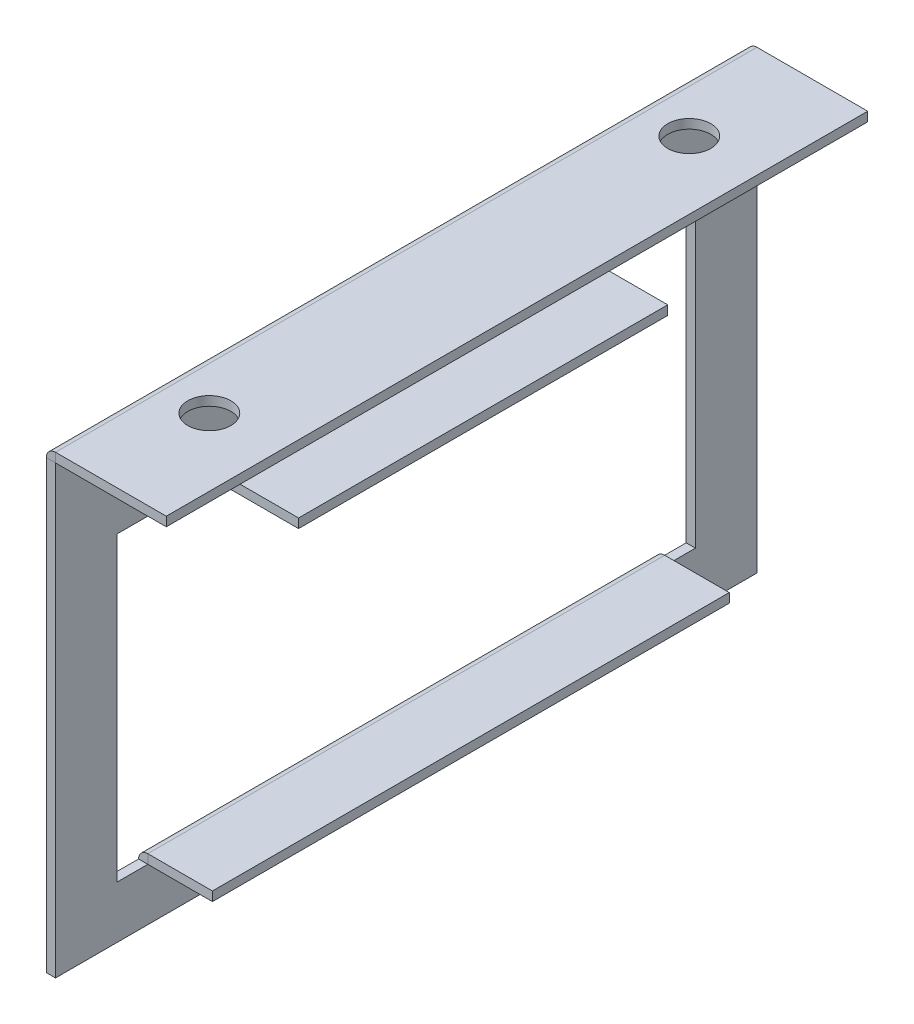
ISO-10303-21;
HEADER;
FILE_DESCRIPTION(('STEP AP214'),'2;1');
FILE_NAME('part.step','',(''),(''),'','','');
FILE_SCHEMA(('AUTOMOTIVE_DESIGN { 1 0 10303 214 1 1 1 1 }'));
ENDSEC;
DATA;
#1=APPLICATION_CONTEXT('core data for automotive mechanical design processes');
#2=APPLICATION_PROTOCOL_DEFINITION('international standard','automotive_design',2000,#1);
#3=PRODUCT_CONTEXT('',#1,'mechanical');
#4=PRODUCT('Part','Part','',(#3));
#5=PRODUCT_RELATED_PRODUCT_CATEGORY('part','',(#4));
#6=PRODUCT_DEFINITION_FORMATION('','',#4);
#7=PRODUCT_DEFINITION_CONTEXT('part definition',#1,'design');
#8=PRODUCT_DEFINITION('design','',#6,#7);
#9=PRODUCT_DEFINITION_SHAPE('','',#8);
#10=(LENGTH_UNIT() NAMED_UNIT(*) SI_UNIT(.MILLI.,.METRE.));
#11=(NAMED_UNIT(*) PLANE_ANGLE_UNIT() SI_UNIT($,.RADIAN.));
#12=(NAMED_UNIT(*) SI_UNIT($,.STERADIAN.) SOLID_ANGLE_UNIT());
#13=UNCERTAINTY_MEASURE_WITH_UNIT(LENGTH_MEASURE(1.E-05),#10,'distance_accuracy_value','');
#14=(GEOMETRIC_REPRESENTATION_CONTEXT(3) GLOBAL_UNCERTAINTY_ASSIGNED_CONTEXT((#13)) GLOBAL_UNIT_ASSIGNED_CONTEXT((#10,
#11,#12)) REPRESENTATION_CONTEXT('',''));
#15=CARTESIAN_POINT('',(0.,0.,0.));
#16=DIRECTION('',(0.,0.,1.));
#17=DIRECTION('',(1.,0.,0.));
#18=AXIS2_PLACEMENT_3D('',#15,#16,#17);
#19=CARTESIAN_POINT('',(0.,-65.5,47.));
#20=DIRECTION('',(0.,-1.,0.));
#21=DIRECTION('',(0.,0.,-1.));
#22=AXIS2_PLACEMENT_3D('',#19,#20,#21);
#23=PLANE('',#22);
#24=DIRECTION('',(1.,0.,0.));
#25=VECTOR('',#24,1.);
#26=CARTESIAN_POINT('',(0.,-65.5,42.));
#27=LINE('',#26,#25);
#28=CARTESIAN_POINT('',(0.,-65.5,42.));
#29=VERTEX_POINT('',#28);
#30=CARTESIAN_POINT('',(1.49999999999998,-65.5,42.));
#31=VERTEX_POINT('',#30);
#32=EDGE_CURVE('E223',#29,#31,#27,.T.);
#33=ORIENTED_EDGE('',*,*,#32,.F.);
#34=DIRECTION('',(0.,0.,-1.));
#35=VECTOR('',#34,1.);
#36=CARTESIAN_POINT('',(0.,-65.5,47.));
#37=LINE('',#36,#35);
#38=CARTESIAN_POINT('',(0.,-65.5,47.));
#39=VERTEX_POINT('',#38);
#40=EDGE_CURVE('E314',#39,#29,#37,.T.);
#41=ORIENTED_EDGE('',*,*,#40,.F.);
#42=DIRECTION('',(1.,0.,0.));
#43=VECTOR('',#42,1.);
#44=CARTESIAN_POINT('',(0.,-65.5,47.));
#45=LINE('',#44,#43);
#46=CARTESIAN_POINT('',(1.5,-65.5,47.));
#47=VERTEX_POINT('',#46);
#48=EDGE_CURVE('E355',#39,#47,#45,.T.);
#49=ORIENTED_EDGE('',*,*,#48,.T.);
#50=DIRECTION('',(0.,0.,-1.));
#51=VECTOR('',#50,1.);
#52=CARTESIAN_POINT('',(1.5,-65.5,47.));
#53=LINE('',#52,#51);
#54=EDGE_CURVE('E255',#47,#31,#53,.T.);
#55=ORIENTED_EDGE('',*,*,#54,.T.);
#56=EDGE_LOOP('',(#33,#41,#49,#55));
#57=FACE_BOUND('',#56,.T.);
#58=ADVANCED_FACE('F39',(#57),#23,.F.);
#59=CARTESIAN_POINT('',(0.,-16.5,47.));
#60=DIRECTION('',(0.,1.,0.));
#61=DIRECTION('',(0.,0.,1.));
#62=AXIS2_PLACEMENT_3D('',#59,#60,#61);
#63=PLANE('',#62);
#64=DIRECTION('',(1.,0.,0.));
#65=VECTOR('',#64,1.);
#66=CARTESIAN_POINT('',(0.,-16.5,-30.));
#67=LINE('',#66,#65);
#68=CARTESIAN_POINT('',(0.,-16.5,-30.));
#69=VERTEX_POINT('',#68);
#70=CARTESIAN_POINT('',(1.5,-16.5,-30.));
#71=VERTEX_POINT('',#70);
#72=EDGE_CURVE('E541',#69,#71,#67,.T.);
#73=ORIENTED_EDGE('',*,*,#72,.F.);
#74=DIRECTION('',(0.,0.,1.));
#75=VECTOR('',#74,1.);
#76=CARTESIAN_POINT('',(0.,-16.5,47.));
#77=LINE('',#76,#75);
#78=CARTESIAN_POINT('',(0.,-16.5,-47.));
#79=VERTEX_POINT('',#78);
#80=EDGE_CURVE('E352',#79,#69,#77,.T.);
#81=ORIENTED_EDGE('',*,*,#80,.F.);
#82=DIRECTION('',(1.,0.,0.));
#83=VECTOR('',#82,1.);
#84=CARTESIAN_POINT('',(0.,-16.5,-47.));
#85=LINE('',#84,#83);
#86=CARTESIAN_POINT('',(1.5,-16.5,-47.));
#87=VERTEX_POINT('',#86);
#88=EDGE_CURVE('E369',#79,#87,#85,.T.);
#89=ORIENTED_EDGE('',*,*,#88,.T.);
#90=DIRECTION('',(0.,0.,1.));
#91=VECTOR('',#90,1.);
#92=CARTESIAN_POINT('',(1.5,-16.5,47.));
#93=LINE('',#92,#91);
#94=EDGE_CURVE('E359',#87,#71,#93,.T.);
#95=ORIENTED_EDGE('',*,*,#94,.T.);
#96=EDGE_LOOP('',(#73,#81,#89,#95));
#97=FACE_BOUND('',#96,.T.);
#98=ADVANCED_FACE('F281',(#97),#63,.F.);
#99=CARTESIAN_POINT('',(1.5,-1.5,57.));
#100=DIRECTION('',(0.,0.,1.));
#101=DIRECTION('',(1.,0.,0.));
#102=AXIS2_PLACEMENT_3D('',#99,#100,#101);
#103=PLANE('',#102);
#104=DIRECTION('',(0.,1.,0.));
#105=VECTOR('',#104,1.);
#106=CARTESIAN_POINT('',(1.5,-1.5,57.));
#107=LINE('',#106,#105);
#108=CARTESIAN_POINT('',(1.5,-1.5,57.));
#109=VERTEX_POINT('',#108);
#110=CARTESIAN_POINT('',(1.5,0.,57.));
#111=VERTEX_POINT('',#110);
#112=EDGE_CURVE('E11',#109,#111,#107,.T.);
#113=ORIENTED_EDGE('',*,*,#112,.F.);
#114=DIRECTION('',(1.,0.,0.));
#115=VECTOR('',#114,1.);
#116=CARTESIAN_POINT('',(0.,-1.5,57.));
#117=LINE('',#116,#115);
#118=CARTESIAN_POINT('',(19.5,-1.5,57.));
#119=VERTEX_POINT('',#118);
#120=EDGE_CURVE('E386',#109,#119,#117,.T.);
#121=ORIENTED_EDGE('',*,*,#120,.T.);
#122=DIRECTION('',(0.,-1.,0.));
#123=VECTOR('',#122,1.);
#124=CARTESIAN_POINT('',(19.5,0.,57.));
#125=LINE('',#124,#123);
#126=CARTESIAN_POINT('',(19.5,0.,57.));
#127=VERTEX_POINT('',#126);
#128=EDGE_CURVE('E388',#127,#119,#125,.T.);
#129=ORIENTED_EDGE('',*,*,#128,.F.);
#130=DIRECTION('',(1.,0.,0.));
#131=VECTOR('',#130,1.);
#132=CARTESIAN_POINT('',(0.,0.,57.));
#133=LINE('',#132,#131);
#134=EDGE_CURVE('E392',#111,#127,#133,.T.);
#135=ORIENTED_EDGE('',*,*,#134,.F.);
#136=EDGE_LOOP('',(#113,#121,#129,#135));
#137=FACE_BOUND('',#136,.T.);
#138=ADVANCED_FACE('F41',(#137),#103,.T.);
#139=CARTESIAN_POINT('',(1.5,-1.5,57.));
#140=DIRECTION('',(0.,0.,1.));
#141=DIRECTION('',(1.,0.,0.));
#142=AXIS2_PLACEMENT_3D('',#139,#140,#141);
#143=PLANE('',#142);
#144=DIRECTION('',(-1.,0.,0.));
#145=VECTOR('',#144,1.);
#146=CARTESIAN_POINT('',(1.5,-1.5,57.));
#147=LINE('',#146,#145);
#148=CARTESIAN_POINT('',(0.,-1.5,57.));
#149=VERTEX_POINT('',#148);
#150=EDGE_CURVE('E48',#109,#149,#147,.T.);
#151=ORIENTED_EDGE('',*,*,#150,.F.);
#152=ORIENTED_EDGE('',*,*,#112,.T.);
#153=CARTESIAN_POINT('',(1.5,-1.5,57.));
#154=DIRECTION('',(0.,0.,1.));
#155=DIRECTION('',(1.,0.,0.));
#156=AXIS2_PLACEMENT_3D('',#153,#154,#155);
#157=CIRCLE('',#156,1.5);
#158=EDGE_CURVE('E395',#149,#111,#157,.F.);
#159=ORIENTED_EDGE('',*,*,#158,.F.);
#160=EDGE_LOOP('',(#151,#152,#159));
#161=FACE_BOUND('',#160,.T.);
#162=ADVANCED_FACE('F461',(#161),#143,.T.);
#163=CARTESIAN_POINT('',(1.5,-1.5,-57.));
#164=DIRECTION('',(0.,0.,-1.));
#165=DIRECTION('',(-1.,0.,0.));
#166=AXIS2_PLACEMENT_3D('',#163,#164,#165);
#167=PLANE('',#166);
#168=DIRECTION('',(-1.,0.,0.));
#169=VECTOR('',#168,1.);
#170=CARTESIAN_POINT('',(1.5,-1.5,-57.));
#171=LINE('',#170,#169);
#172=CARTESIAN_POINT('',(1.5,-1.5,-57.));
#173=VERTEX_POINT('',#172);
#174=CARTESIAN_POINT('',(0.,-1.5,-57.));
#175=VERTEX_POINT('',#174);
#176=EDGE_CURVE('E445',#173,#175,#171,.T.);
#177=ORIENTED_EDGE('',*,*,#176,.F.);
#178=DIRECTION('',(0.,1.,0.));
#179=VECTOR('',#178,1.);
#180=CARTESIAN_POINT('',(1.5,-74.,-57.));
#181=LINE('',#180,#179);
#182=CARTESIAN_POINT('',(1.5,-74.,-57.));
#183=VERTEX_POINT('',#182);
#184=EDGE_CURVE('E389',#183,#173,#181,.T.);
#185=ORIENTED_EDGE('',*,*,#184,.F.);
#186=DIRECTION('',(-1.,0.,0.));
#187=VECTOR('',#186,1.);
#188=CARTESIAN_POINT('',(1.5,-74.,-57.));
#189=LINE('',#188,#187);
#190=CARTESIAN_POINT('',(0.,-74.,-57.));
#191=VERTEX_POINT('',#190);
#192=EDGE_CURVE('E422',#183,#191,#189,.T.);
#193=ORIENTED_EDGE('',*,*,#192,.T.);
#194=DIRECTION('',(0.,1.,0.));
#195=VECTOR('',#194,1.);
#196=CARTESIAN_POINT('',(0.,-74.,-57.));
#197=LINE('',#196,#195);
#198=EDGE_CURVE('E419',#191,#175,#197,.T.);
#199=ORIENTED_EDGE('',*,*,#198,.T.);
#200=EDGE_LOOP('',(#177,#185,#193,#199));
#201=FACE_BOUND('',#200,.T.);
#202=ADVANCED_FACE('F484',(#201),#167,.T.);
#203=CARTESIAN_POINT('',(1.5,-1.5,-57.));
#204=DIRECTION('',(0.,0.,-1.));
#205=DIRECTION('',(-1.,0.,0.));
#206=AXIS2_PLACEMENT_3D('',#203,#204,#205);
#207=PLANE('',#206);
#208=DIRECTION('',(0.,1.,0.));
#209=VECTOR('',#208,1.);
#210=CARTESIAN_POINT('',(1.5,-1.5,-57.));
#211=LINE('',#210,#209);
#212=CARTESIAN_POINT('',(1.5,0.,-57.));
#213=VERTEX_POINT('',#212);
#214=EDGE_CURVE('E443',#173,#213,#211,.T.);
#215=ORIENTED_EDGE('',*,*,#214,.F.);
#216=ORIENTED_EDGE('',*,*,#176,.T.);
#217=CARTESIAN_POINT('',(1.5,-1.5,-57.));
#218=DIRECTION('',(0.,0.,1.));
#219=DIRECTION('',(1.,0.,0.));
#220=AXIS2_PLACEMENT_3D('',#217,#218,#219);
#221=CIRCLE('',#220,1.5);
#222=EDGE_CURVE('E416',#175,#213,#221,.F.);
#223=ORIENTED_EDGE('',*,*,#222,.T.);
#224=EDGE_LOOP('',(#215,#216,#223));
#225=FACE_BOUND('',#224,.T.);
#226=ADVANCED_FACE('F482',(#225),#207,.T.);
#227=CARTESIAN_POINT('',(0.,-1.5,57.));
#228=DIRECTION('',(0.,1.,0.));
#229=DIRECTION('',(0.,0.,1.));
#230=AXIS2_PLACEMENT_3D('',#227,#228,#229);
#231=PLANE('',#230);
#232=CARTESIAN_POINT('',(8.5,-1.5,-39.));
#233=DIRECTION('',(0.,1.,0.));
#234=DIRECTION('',(0.,0.,1.));
#235=AXIS2_PLACEMENT_3D('',#232,#233,#234);
#236=CIRCLE('',#235,3.5);
#237=CARTESIAN_POINT('',(8.5,-1.5,-35.5));
#238=VERTEX_POINT('',#237);
#239=EDGE_CURVE('E376',#238,#238,#236,.T.);
#240=ORIENTED_EDGE('',*,*,#239,.T.);
#241=EDGE_LOOP('',(#240));
#242=FACE_BOUND('',#241,.T.);
#243=CARTESIAN_POINT('',(8.5,-1.5,39.));
#244=DIRECTION('',(0.,1.,0.));
#245=DIRECTION('',(0.,0.,1.));
#246=AXIS2_PLACEMENT_3D('',#243,#244,#245);
#247=CIRCLE('',#246,3.5);
#248=CARTESIAN_POINT('',(8.5,-1.5,42.5));
#249=VERTEX_POINT('',#248);
#250=EDGE_CURVE('E382',#249,#249,#247,.T.);
#251=ORIENTED_EDGE('',*,*,#250,.T.);
#252=EDGE_LOOP('',(#251));
#253=FACE_BOUND('',#252,.T.);
#254=DIRECTION('',(1.,0.,0.));
#255=VECTOR('',#254,1.);
#256=CARTESIAN_POINT('',(0.,-1.5,-57.));
#257=LINE('',#256,#255);
#258=CARTESIAN_POINT('',(19.5,-1.5,-57.));
#259=VERTEX_POINT('',#258);
#260=EDGE_CURVE('E385',#173,#259,#257,.T.);
#261=ORIENTED_EDGE('',*,*,#260,.T.);
#262=DIRECTION('',(0.,0.,-1.));
#263=VECTOR('',#262,1.);
#264=CARTESIAN_POINT('',(19.5,-1.5,57.));
#265=LINE('',#264,#263);
#266=EDGE_CURVE('E441',#119,#259,#265,.T.);
#267=ORIENTED_EDGE('',*,*,#266,.F.);
#268=ORIENTED_EDGE('',*,*,#120,.F.);
#269=DIRECTION('',(0.,0.,-1.));
#270=VECTOR('',#269,1.);
#271=CARTESIAN_POINT('',(1.5,-1.5,57.));
#272=LINE('',#271,#270);
#273=EDGE_CURVE('E407',#109,#173,#272,.T.);
#274=ORIENTED_EDGE('',*,*,#273,.T.);
#275=EDGE_LOOP('',(#261,#267,#268,#274));
#276=FACE_BOUND('',#275,.T.);
#277=ADVANCED_FACE('F471',(#242,#253,#276),#231,.F.);
#278=CARTESIAN_POINT('',(19.5,0.,57.));
#279=DIRECTION('',(1.,0.,0.));
#280=DIRECTION('',(0.,0.,-1.));
#281=AXIS2_PLACEMENT_3D('',#278,#279,#280);
#282=PLANE('',#281);
#283=DIRECTION('',(0.,-1.,0.));
#284=VECTOR('',#283,1.);
#285=CARTESIAN_POINT('',(19.5,0.,-57.));
#286=LINE('',#285,#284);
#287=CARTESIAN_POINT('',(19.5,0.,-57.));
#288=VERTEX_POINT('',#287);
#289=EDGE_CURVE('E410',#288,#259,#286,.T.);
#290=ORIENTED_EDGE('',*,*,#289,.F.);
#291=DIRECTION('',(0.,0.,-1.));
#292=VECTOR('',#291,1.);
#293=CARTESIAN_POINT('',(19.5,0.,57.));
#294=LINE('',#293,#292);
#295=EDGE_CURVE('E439',#127,#288,#294,.T.);
#296=ORIENTED_EDGE('',*,*,#295,.F.);
#297=ORIENTED_EDGE('',*,*,#128,.T.);
#298=ORIENTED_EDGE('',*,*,#266,.T.);
#299=EDGE_LOOP('',(#290,#296,#297,#298));
#300=FACE_BOUND('',#299,.T.);
#301=ADVANCED_FACE('F495',(#300),#282,.T.);
#302=CARTESIAN_POINT('',(0.,0.,57.));
#303=DIRECTION('',(0.,1.,0.));
#304=DIRECTION('',(0.,0.,1.));
#305=AXIS2_PLACEMENT_3D('',#302,#303,#304);
#306=PLANE('',#305);
#307=CARTESIAN_POINT('',(8.5,0.,-39.));
#308=DIRECTION('',(0.,1.,0.));
#309=DIRECTION('',(0.,0.,1.));
#310=AXIS2_PLACEMENT_3D('',#307,#308,#309);
#311=CIRCLE('',#310,3.5);
#312=CARTESIAN_POINT('',(8.5,0.,-35.5));
#313=VERTEX_POINT('',#312);
#314=EDGE_CURVE('E368',#313,#313,#311,.T.);
#315=ORIENTED_EDGE('',*,*,#314,.F.);
#316=EDGE_LOOP('',(#315));
#317=FACE_BOUND('',#316,.T.);
#318=CARTESIAN_POINT('',(8.5,0.,39.));
#319=DIRECTION('',(0.,1.,0.));
#320=DIRECTION('',(0.,0.,1.));
#321=AXIS2_PLACEMENT_3D('',#318,#319,#320);
#322=CIRCLE('',#321,3.5);
#323=CARTESIAN_POINT('',(8.5,0.,42.5));
#324=VERTEX_POINT('',#323);
#325=EDGE_CURVE('E379',#324,#324,#322,.T.);
#326=ORIENTED_EDGE('',*,*,#325,.F.);
#327=EDGE_LOOP('',(#326));
#328=FACE_BOUND('',#327,.T.);
#329=DIRECTION('',(1.,0.,0.));
#330=VECTOR('',#329,1.);
#331=CARTESIAN_POINT('',(0.,0.,-57.));
#332=LINE('',#331,#330);
#333=EDGE_CURVE('E413',#213,#288,#332,.T.);
#334=ORIENTED_EDGE('',*,*,#333,.F.);
#335=DIRECTION('',(0.,0.,-1.));
#336=VECTOR('',#335,1.);
#337=CARTESIAN_POINT('',(1.5,0.,57.));
#338=LINE('',#337,#336);
#339=EDGE_CURVE('E436',#111,#213,#338,.T.);
#340=ORIENTED_EDGE('',*,*,#339,.F.);
#341=ORIENTED_EDGE('',*,*,#134,.T.);
#342=ORIENTED_EDGE('',*,*,#295,.T.);
#343=EDGE_LOOP('',(#334,#340,#341,#342));
#344=FACE_BOUND('',#343,.T.);
#345=ADVANCED_FACE('F477',(#317,#328,#344),#306,.T.);
#346=CARTESIAN_POINT('',(1.5,-1.5,57.));
#347=DIRECTION('',(0.,0.,-1.));
#348=DIRECTION('',(-1.,0.,0.));
#349=AXIS2_PLACEMENT_3D('',#346,#347,#348);
#350=CYLINDRICAL_SURFACE('',#349,1.5);
#351=ORIENTED_EDGE('',*,*,#222,.F.);
#352=DIRECTION('',(0.,0.,-1.));
#353=VECTOR('',#352,1.);
#354=CARTESIAN_POINT('',(0.,-1.5,57.));
#355=LINE('',#354,#353);
#356=EDGE_CURVE('E433',#149,#175,#355,.T.);
#357=ORIENTED_EDGE('',*,*,#356,.F.);
#358=ORIENTED_EDGE('',*,*,#158,.T.);
#359=ORIENTED_EDGE('',*,*,#339,.T.);
#360=EDGE_LOOP('',(#351,#357,#358,#359));
#361=FACE_BOUND('',#360,.T.);
#362=ADVANCED_FACE('F459',(#361),#350,.T.);
#363=CARTESIAN_POINT('',(0.,-74.,57.));
#364=DIRECTION('',(-1.,0.,0.));
#365=DIRECTION('',(0.,0.,1.));
#366=AXIS2_PLACEMENT_3D('',#363,#364,#365);
#367=PLANE('',#366);
#368=DIRECTION('',(0.,-1.,0.));
#369=VECTOR('',#368,1.);
#370=CARTESIAN_POINT('',(0.,-16.5,47.));
#371=LINE('',#370,#369);
#372=CARTESIAN_POINT('',(0.,-16.5,47.));
#373=VERTEX_POINT('',#372);
#374=EDGE_CURVE('E315',#373,#39,#371,.T.);
#375=ORIENTED_EDGE('',*,*,#374,.T.);
#376=ORIENTED_EDGE('',*,*,#40,.T.);
#377=DIRECTION('',(0.,0.,-1.));
#378=VECTOR('',#377,1.);
#379=CARTESIAN_POINT('',(0.,-65.5,-42.));
#380=LINE('',#379,#378);
#381=CARTESIAN_POINT('',(0.,-65.5,-42.));
#382=VERTEX_POINT('',#381);
#383=EDGE_CURVE('E227',#29,#382,#380,.T.);
#384=ORIENTED_EDGE('',*,*,#383,.T.);
#385=CARTESIAN_POINT('',(0.,-65.5,-47.));
#386=VERTEX_POINT('',#385);
#387=EDGE_CURVE('E306',#382,#386,#37,.T.);
#388=ORIENTED_EDGE('',*,*,#387,.T.);
#389=DIRECTION('',(0.,1.,0.));
#390=VECTOR('',#389,1.);
#391=CARTESIAN_POINT('',(0.,-16.5,-47.));
#392=LINE('',#391,#390);
#393=EDGE_CURVE('E340',#386,#79,#392,.T.);
#394=ORIENTED_EDGE('',*,*,#393,.T.);
#395=ORIENTED_EDGE('',*,*,#80,.T.);
#396=DIRECTION('',(0.,0.,-1.));
#397=VECTOR('',#396,1.);
#398=CARTESIAN_POINT('',(0.,-16.5,-30.));
#399=LINE('',#398,#397);
#400=CARTESIAN_POINT('',(0.,-16.5,30.));
#401=VERTEX_POINT('',#400);
#402=EDGE_CURVE('E557',#401,#69,#399,.T.);
#403=ORIENTED_EDGE('',*,*,#402,.F.);
#404=EDGE_CURVE('E343',#401,#373,#77,.T.);
#405=ORIENTED_EDGE('',*,*,#404,.T.);
#406=EDGE_LOOP('',(#375,#376,#384,#388,#394,#395,#403,#405));
#407=FACE_BOUND('',#406,.T.);
#408=ORIENTED_EDGE('',*,*,#198,.F.);
#409=DIRECTION('',(0.,0.,-1.));
#410=VECTOR('',#409,1.);
#411=CARTESIAN_POINT('',(0.,-74.,57.));
#412=LINE('',#411,#410);
#413=CARTESIAN_POINT('',(0.,-74.,57.));
#414=VERTEX_POINT('',#413);
#415=EDGE_CURVE('E431',#414,#191,#412,.T.);
#416=ORIENTED_EDGE('',*,*,#415,.F.);
#417=DIRECTION('',(0.,1.,0.));
#418=VECTOR('',#417,1.);
#419=CARTESIAN_POINT('',(0.,-74.,57.));
#420=LINE('',#419,#418);
#421=EDGE_CURVE('E398',#414,#149,#420,.T.);
#422=ORIENTED_EDGE('',*,*,#421,.T.);
#423=ORIENTED_EDGE('',*,*,#356,.T.);
#424=EDGE_LOOP('',(#408,#416,#422,#423));
#425=FACE_BOUND('',#424,.T.);
#426=ADVANCED_FACE('F318',(#407,#425),#367,.T.);
#427=CARTESIAN_POINT('',(1.5,-74.,57.));
#428=DIRECTION('',(0.,-1.,0.));
#429=DIRECTION('',(0.,0.,-1.));
#430=AXIS2_PLACEMENT_3D('',#427,#428,#429);
#431=PLANE('',#430);
#432=ORIENTED_EDGE('',*,*,#192,.F.);
#433=DIRECTION('',(0.,0.,-1.));
#434=VECTOR('',#433,1.);
#435=CARTESIAN_POINT('',(1.5,-74.,57.));
#436=LINE('',#435,#434);
#437=CARTESIAN_POINT('',(1.5,-74.,57.));
#438=VERTEX_POINT('',#437);
#439=EDGE_CURVE('E429',#438,#183,#436,.T.);
#440=ORIENTED_EDGE('',*,*,#439,.F.);
#441=DIRECTION('',(-1.,0.,0.));
#442=VECTOR('',#441,1.);
#443=CARTESIAN_POINT('',(1.5,-74.,57.));
#444=LINE('',#443,#442);
#445=EDGE_CURVE('E401',#438,#414,#444,.T.);
#446=ORIENTED_EDGE('',*,*,#445,.T.);
#447=ORIENTED_EDGE('',*,*,#415,.T.);
#448=EDGE_LOOP('',(#432,#440,#446,#447));
#449=FACE_BOUND('',#448,.T.);
#450=ADVANCED_FACE('F465',(#449),#431,.T.);
#451=CARTESIAN_POINT('',(1.5,-74.,57.));
#452=DIRECTION('',(-1.,0.,0.));
#453=DIRECTION('',(0.,0.,1.));
#454=AXIS2_PLACEMENT_3D('',#451,#452,#453);
#455=PLANE('',#454);
#456=ORIENTED_EDGE('',*,*,#54,.F.);
#457=DIRECTION('',(0.,-1.,0.));
#458=VECTOR('',#457,1.);
#459=CARTESIAN_POINT('',(1.5,-16.5,47.));
#460=LINE('',#459,#458);
#461=CARTESIAN_POINT('',(1.5,-16.5,47.));
#462=VERTEX_POINT('',#461);
#463=EDGE_CURVE('E346',#462,#47,#460,.T.);
#464=ORIENTED_EDGE('',*,*,#463,.F.);
#465=CARTESIAN_POINT('',(1.5,-16.5,30.));
#466=VERTEX_POINT('',#465);
#467=EDGE_CURVE('E356',#466,#462,#93,.T.);
#468=ORIENTED_EDGE('',*,*,#467,.F.);
#469=DIRECTION('',(0.,0.,-1.));
#470=VECTOR('',#469,1.);
#471=CARTESIAN_POINT('',(1.5,-16.5,-30.));
#472=LINE('',#471,#470);
#473=EDGE_CURVE('E544',#466,#71,#472,.T.);
#474=ORIENTED_EDGE('',*,*,#473,.T.);
#475=ORIENTED_EDGE('',*,*,#94,.F.);
#476=DIRECTION('',(0.,1.,0.));
#477=VECTOR('',#476,1.);
#478=CARTESIAN_POINT('',(1.5,-16.5,-47.));
#479=LINE('',#478,#477);
#480=CARTESIAN_POINT('',(1.5,-65.5,-47.));
#481=VERTEX_POINT('',#480);
#482=EDGE_CURVE('E360',#481,#87,#479,.T.);
#483=ORIENTED_EDGE('',*,*,#482,.F.);
#484=CARTESIAN_POINT('',(1.5,-65.5,-42.));
#485=VERTEX_POINT('',#484);
#486=EDGE_CURVE('E257',#485,#481,#53,.T.);
#487=ORIENTED_EDGE('',*,*,#486,.F.);
#488=DIRECTION('',(0.,0.,-1.));
#489=VECTOR('',#488,1.);
#490=CARTESIAN_POINT('',(1.5,-65.5,-42.));
#491=LINE('',#490,#489);
#492=EDGE_CURVE('E234',#31,#485,#491,.T.);
#493=ORIENTED_EDGE('',*,*,#492,.F.);
#494=EDGE_LOOP('',(#456,#464,#468,#474,#475,#483,#487,#493));
#495=FACE_BOUND('',#494,.T.);
#496=ORIENTED_EDGE('',*,*,#184,.T.);
#497=ORIENTED_EDGE('',*,*,#273,.F.);
#498=DIRECTION('',(0.,1.,0.));
#499=VECTOR('',#498,1.);
#500=CARTESIAN_POINT('',(1.5,-74.,57.));
#501=LINE('',#500,#499);
#502=EDGE_CURVE('E404',#438,#109,#501,.T.);
#503=ORIENTED_EDGE('',*,*,#502,.F.);
#504=ORIENTED_EDGE('',*,*,#439,.T.);
#505=EDGE_LOOP('',(#496,#497,#503,#504));
#506=FACE_BOUND('',#505,.T.);
#507=ADVANCED_FACE('F252',(#495,#506),#455,.F.);
#508=CARTESIAN_POINT('',(1.5,-1.5,57.));
#509=DIRECTION('',(0.,0.,1.));
#510=DIRECTION('',(1.,0.,0.));
#511=AXIS2_PLACEMENT_3D('',#508,#509,#510);
#512=PLANE('',#511);
#513=ORIENTED_EDGE('',*,*,#502,.T.);
#514=ORIENTED_EDGE('',*,*,#150,.T.);
#515=ORIENTED_EDGE('',*,*,#421,.F.);
#516=ORIENTED_EDGE('',*,*,#445,.F.);
#517=EDGE_LOOP('',(#513,#514,#515,#516));
#518=FACE_BOUND('',#517,.T.);
#519=ADVANCED_FACE('F451',(#518),#512,.T.);
#520=CARTESIAN_POINT('',(1.5,-1.5,-57.));
#521=DIRECTION('',(0.,0.,1.));
#522=DIRECTION('',(1.,0.,0.));
#523=AXIS2_PLACEMENT_3D('',#520,#521,#522);
#524=PLANE('',#523);
#525=ORIENTED_EDGE('',*,*,#260,.F.);
#526=ORIENTED_EDGE('',*,*,#214,.T.);
#527=ORIENTED_EDGE('',*,*,#333,.T.);
#528=ORIENTED_EDGE('',*,*,#289,.T.);
#529=EDGE_LOOP('',(#525,#526,#527,#528));
#530=FACE_BOUND('',#529,.T.);
#531=ADVANCED_FACE('F511',(#530),#524,.F.);
#532=CARTESIAN_POINT('',(8.5,-74.,39.));
#533=DIRECTION('',(0.,1.,0.));
#534=DIRECTION('',(0.,0.,1.));
#535=AXIS2_PLACEMENT_3D('',#532,#533,#534);
#536=CYLINDRICAL_SURFACE('',#535,3.5);
#537=ORIENTED_EDGE('',*,*,#325,.T.);
#538=EDGE_LOOP('',(#537));
#539=FACE_BOUND('',#538,.T.);
#540=ORIENTED_EDGE('',*,*,#250,.F.);
#541=EDGE_LOOP('',(#540));
#542=FACE_BOUND('',#541,.T.);
#543=ADVANCED_FACE('F514',(#539,#542),#536,.F.);
#544=CARTESIAN_POINT('',(8.5,-74.,-39.));
#545=DIRECTION('',(0.,1.,0.));
#546=DIRECTION('',(0.,0.,1.));
#547=AXIS2_PLACEMENT_3D('',#544,#545,#546);
#548=CYLINDRICAL_SURFACE('',#547,3.5);
#549=ORIENTED_EDGE('',*,*,#314,.T.);
#550=EDGE_LOOP('',(#549));
#551=FACE_BOUND('',#550,.T.);
#552=ORIENTED_EDGE('',*,*,#239,.F.);
#553=EDGE_LOOP('',(#552));
#554=FACE_BOUND('',#553,.T.);
#555=ADVANCED_FACE('F519',(#551,#554),#548,.F.);
#556=CARTESIAN_POINT('',(0.,-16.5,47.));
#557=DIRECTION('',(0.,0.,1.));
#558=DIRECTION('',(0.,-1.,0.));
#559=AXIS2_PLACEMENT_3D('',#556,#557,#558);
#560=PLANE('',#559);
#561=ORIENTED_EDGE('',*,*,#463,.T.);
#562=ORIENTED_EDGE('',*,*,#48,.F.);
#563=ORIENTED_EDGE('',*,*,#374,.F.);
#564=DIRECTION('',(1.,0.,0.));
#565=VECTOR('',#564,1.);
#566=CARTESIAN_POINT('',(0.,-16.5,47.));
#567=LINE('',#566,#565);
#568=EDGE_CURVE('E364',#373,#462,#567,.T.);
#569=ORIENTED_EDGE('',*,*,#568,.T.);
#570=EDGE_LOOP('',(#561,#562,#563,#569));
#571=FACE_BOUND('',#570,.T.);
#572=ADVANCED_FACE('F522',(#571),#560,.F.);
#573=ORIENTED_EDGE('',*,*,#404,.F.);
#574=DIRECTION('',(1.,0.,0.));
#575=VECTOR('',#574,1.);
#576=CARTESIAN_POINT('',(0.,-16.5,30.));
#577=LINE('',#576,#575);
#578=EDGE_CURVE('E600',#401,#466,#577,.T.);
#579=ORIENTED_EDGE('',*,*,#578,.T.);
#580=ORIENTED_EDGE('',*,*,#467,.T.);
#581=ORIENTED_EDGE('',*,*,#568,.F.);
#582=EDGE_LOOP('',(#573,#579,#580,#581));
#583=FACE_BOUND('',#582,.T.);
#584=ADVANCED_FACE('F289',(#583),#63,.F.);
#585=CARTESIAN_POINT('',(0.,-16.5,-47.));
#586=DIRECTION('',(0.,0.,-1.));
#587=DIRECTION('',(0.,1.,0.));
#588=AXIS2_PLACEMENT_3D('',#585,#586,#587);
#589=PLANE('',#588);
#590=ORIENTED_EDGE('',*,*,#482,.T.);
#591=ORIENTED_EDGE('',*,*,#88,.F.);
#592=ORIENTED_EDGE('',*,*,#393,.F.);
#593=DIRECTION('',(1.,0.,0.));
#594=VECTOR('',#593,1.);
#595=CARTESIAN_POINT('',(0.,-65.5,-47.));
#596=LINE('',#595,#594);
#597=EDGE_CURVE('E310',#386,#481,#596,.T.);
#598=ORIENTED_EDGE('',*,*,#597,.T.);
#599=EDGE_LOOP('',(#590,#591,#592,#598));
#600=FACE_BOUND('',#599,.T.);
#601=ADVANCED_FACE('F294',(#600),#589,.F.);
#602=ORIENTED_EDGE('',*,*,#387,.F.);
#603=DIRECTION('',(1.,0.,0.));
#604=VECTOR('',#603,1.);
#605=CARTESIAN_POINT('',(0.,-65.5,-42.));
#606=LINE('',#605,#604);
#607=EDGE_CURVE('E308',#382,#485,#606,.T.);
#608=ORIENTED_EDGE('',*,*,#607,.T.);
#609=ORIENTED_EDGE('',*,*,#486,.T.);
#610=ORIENTED_EDGE('',*,*,#597,.F.);
#611=EDGE_LOOP('',(#602,#608,#609,#610));
#612=FACE_BOUND('',#611,.T.);
#613=ADVANCED_FACE('F283',(#612),#23,.F.);
#614=CARTESIAN_POINT('',(0.,-16.5,-30.));
#615=DIRECTION('',(0.,0.,-1.));
#616=DIRECTION('',(-1.,0.,0.));
#617=AXIS2_PLACEMENT_3D('',#614,#615,#616);
#618=PLANE('',#617);
#619=CARTESIAN_POINT('',(1.5,-16.5,-30.));
#620=DIRECTION('',(0.,0.,1.));
#621=DIRECTION('',(1.,0.,0.));
#622=AXIS2_PLACEMENT_3D('',#619,#620,#621);
#623=CIRCLE('',#622,1.5);
#624=CARTESIAN_POINT('',(1.49999999999999,-18.,-30.));
#625=VERTEX_POINT('',#624);
#626=EDGE_CURVE('E533',#69,#625,#623,.T.);
#627=ORIENTED_EDGE('',*,*,#626,.F.);
#628=ORIENTED_EDGE('',*,*,#72,.T.);
#629=DIRECTION('',(0.,1.,0.));
#630=VECTOR('',#629,1.);
#631=CARTESIAN_POINT('',(1.49999999999999,-18.,-30.));
#632=LINE('',#631,#630);
#633=EDGE_CURVE('E554',#625,#71,#632,.T.);
#634=ORIENTED_EDGE('',*,*,#633,.F.);
#635=EDGE_LOOP('',(#627,#628,#634));
#636=FACE_BOUND('',#635,.T.);
#637=ADVANCED_FACE('F293',(#636),#618,.T.);
#638=CARTESIAN_POINT('',(1.49999999999999,-16.5,30.));
#639=DIRECTION('',(0.,0.,1.));
#640=DIRECTION('',(1.,0.,0.));
#641=AXIS2_PLACEMENT_3D('',#638,#639,#640);
#642=CYLINDRICAL_SURFACE('',#641,1.5);
#643=CARTESIAN_POINT('',(1.49999999999999,-16.5,30.));
#644=DIRECTION('',(0.,0.,1.));
#645=DIRECTION('',(1.,0.,0.));
#646=AXIS2_PLACEMENT_3D('',#643,#644,#645);
#647=CIRCLE('',#646,1.5);
#648=CARTESIAN_POINT('',(1.49999999999998,-18.,30.));
#649=VERTEX_POINT('',#648);
#650=EDGE_CURVE('E602',#401,#649,#647,.T.);
#651=ORIENTED_EDGE('',*,*,#650,.F.);
#652=ORIENTED_EDGE('',*,*,#402,.T.);
#653=ORIENTED_EDGE('',*,*,#626,.T.);
#654=DIRECTION('',(0.,0.,-1.));
#655=VECTOR('',#654,1.);
#656=CARTESIAN_POINT('',(1.49999999999999,-18.,-30.));
#657=LINE('',#656,#655);
#658=EDGE_CURVE('E565',#649,#625,#657,.T.);
#659=ORIENTED_EDGE('',*,*,#658,.F.);
#660=EDGE_LOOP('',(#651,#652,#653,#659));
#661=FACE_BOUND('',#660,.T.);
#662=ADVANCED_FACE('F300',(#661),#642,.T.);
#663=CARTESIAN_POINT('',(0.,-16.5,30.));
#664=DIRECTION('',(0.,0.,-1.));
#665=DIRECTION('',(-1.,0.,0.));
#666=AXIS2_PLACEMENT_3D('',#663,#664,#665);
#667=PLANE('',#666);
#668=ORIENTED_EDGE('',*,*,#578,.F.);
#669=ORIENTED_EDGE('',*,*,#650,.T.);
#670=DIRECTION('',(0.,1.,0.));
#671=VECTOR('',#670,1.);
#672=CARTESIAN_POINT('',(1.49999999999998,-18.,30.));
#673=LINE('',#672,#671);
#674=EDGE_CURVE('E64',#649,#466,#673,.T.);
#675=ORIENTED_EDGE('',*,*,#674,.T.);
#676=EDGE_LOOP('',(#668,#669,#675));
#677=FACE_BOUND('',#676,.T.);
#678=ADVANCED_FACE('F609',(#677),#667,.F.);
#679=CARTESIAN_POINT('',(14.,-18.,-30.));
#680=DIRECTION('',(0.,0.,1.));
#681=DIRECTION('',(0.,-1.,0.));
#682=AXIS2_PLACEMENT_3D('',#679,#680,#681);
#683=PLANE('',#682);
#684=DIRECTION('',(1.,0.,0.));
#685=VECTOR('',#684,1.);
#686=CARTESIAN_POINT('',(14.,-16.5,-30.));
#687=LINE('',#686,#685);
#688=CARTESIAN_POINT('',(14.,-16.5,-30.));
#689=VERTEX_POINT('',#688);
#690=EDGE_CURVE('E329',#71,#689,#687,.T.);
#691=ORIENTED_EDGE('',*,*,#690,.T.);
#692=DIRECTION('',(0.,1.,0.));
#693=VECTOR('',#692,1.);
#694=CARTESIAN_POINT('',(14.,-18.,-30.));
#695=LINE('',#694,#693);
#696=CARTESIAN_POINT('',(14.,-18.,-30.));
#697=VERTEX_POINT('',#696);
#698=EDGE_CURVE('E558',#697,#689,#695,.T.);
#699=ORIENTED_EDGE('',*,*,#698,.F.);
#700=DIRECTION('',(1.,0.,0.));
#701=VECTOR('',#700,1.);
#702=CARTESIAN_POINT('',(14.,-18.,-30.));
#703=LINE('',#702,#701);
#704=EDGE_CURVE('E549',#625,#697,#703,.T.);
#705=ORIENTED_EDGE('',*,*,#704,.F.);
#706=ORIENTED_EDGE('',*,*,#633,.T.);
#707=EDGE_LOOP('',(#691,#699,#705,#706));
#708=FACE_BOUND('',#707,.T.);
#709=ADVANCED_FACE('F562',(#708),#683,.F.);
#710=CARTESIAN_POINT('',(14.,-18.,30.));
#711=DIRECTION('',(-1.,0.,0.));
#712=DIRECTION('',(0.,-1.,0.));
#713=AXIS2_PLACEMENT_3D('',#710,#711,#712);
#714=PLANE('',#713);
#715=DIRECTION('',(0.,0.,1.));
#716=VECTOR('',#715,1.);
#717=CARTESIAN_POINT('',(14.,-16.5,30.));
#718=LINE('',#717,#716);
#719=CARTESIAN_POINT('',(14.,-16.5,30.));
#720=VERTEX_POINT('',#719);
#721=EDGE_CURVE('E331',#689,#720,#718,.T.);
#722=ORIENTED_EDGE('',*,*,#721,.T.);
#723=DIRECTION('',(0.,1.,0.));
#724=VECTOR('',#723,1.);
#725=CARTESIAN_POINT('',(14.,-18.,30.));
#726=LINE('',#725,#724);
#727=CARTESIAN_POINT('',(14.,-18.,30.));
#728=VERTEX_POINT('',#727);
#729=EDGE_CURVE('E575',#728,#720,#726,.T.);
#730=ORIENTED_EDGE('',*,*,#729,.F.);
#731=DIRECTION('',(0.,0.,1.));
#732=VECTOR('',#731,1.);
#733=CARTESIAN_POINT('',(14.,-18.,30.));
#734=LINE('',#733,#732);
#735=EDGE_CURVE('E574',#697,#728,#734,.T.);
#736=ORIENTED_EDGE('',*,*,#735,.F.);
#737=ORIENTED_EDGE('',*,*,#698,.T.);
#738=EDGE_LOOP('',(#722,#730,#736,#737));
#739=FACE_BOUND('',#738,.T.);
#740=ADVANCED_FACE('F573',(#739),#714,.F.);
#741=CARTESIAN_POINT('',(1.49999999999998,-18.,30.));
#742=DIRECTION('',(0.,0.,-1.));
#743=DIRECTION('',(0.,1.,0.));
#744=AXIS2_PLACEMENT_3D('',#741,#742,#743);
#745=PLANE('',#744);
#746=DIRECTION('',(-1.,0.,0.));
#747=VECTOR('',#746,1.);
#748=CARTESIAN_POINT('',(1.49999999999999,-16.5,30.));
#749=LINE('',#748,#747);
#750=EDGE_CURVE('E550',#720,#466,#749,.T.);
#751=ORIENTED_EDGE('',*,*,#750,.T.);
#752=ORIENTED_EDGE('',*,*,#674,.F.);
#753=DIRECTION('',(-1.,0.,0.));
#754=VECTOR('',#753,1.);
#755=CARTESIAN_POINT('',(1.49999999999998,-18.,30.));
#756=LINE('',#755,#754);
#757=EDGE_CURVE('E612',#728,#649,#756,.T.);
#758=ORIENTED_EDGE('',*,*,#757,.F.);
#759=ORIENTED_EDGE('',*,*,#729,.T.);
#760=EDGE_LOOP('',(#751,#752,#758,#759));
#761=FACE_BOUND('',#760,.T.);
#762=ADVANCED_FACE('F618',(#761),#745,.F.);
#763=CARTESIAN_POINT('',(0.,-18.,0.));
#764=DIRECTION('',(0.,1.,0.));
#765=DIRECTION('',(-1.,0.,0.));
#766=AXIS2_PLACEMENT_3D('',#763,#764,#765);
#767=PLANE('',#766);
#768=ORIENTED_EDGE('',*,*,#704,.T.);
#769=ORIENTED_EDGE('',*,*,#735,.T.);
#770=ORIENTED_EDGE('',*,*,#757,.T.);
#771=ORIENTED_EDGE('',*,*,#658,.T.);
#772=EDGE_LOOP('',(#768,#769,#770,#771));
#773=FACE_BOUND('',#772,.T.);
#774=ADVANCED_FACE('F615',(#773),#767,.F.);
#775=CARTESIAN_POINT('',(0.,-16.5,0.));
#776=DIRECTION('',(0.,1.,0.));
#777=DIRECTION('',(-1.,0.,0.));
#778=AXIS2_PLACEMENT_3D('',#775,#776,#777);
#779=PLANE('',#778);
#780=ORIENTED_EDGE('',*,*,#690,.F.);
#781=ORIENTED_EDGE('',*,*,#473,.F.);
#782=ORIENTED_EDGE('',*,*,#750,.F.);
#783=ORIENTED_EDGE('',*,*,#721,.F.);
#784=EDGE_LOOP('',(#780,#781,#782,#783));
#785=FACE_BOUND('',#784,.T.);
#786=ADVANCED_FACE('F567',(#785),#779,.T.);
#787=CARTESIAN_POINT('',(0.,-65.5,42.));
#788=DIRECTION('',(0.,0.,1.));
#789=DIRECTION('',(1.,0.,0.));
#790=AXIS2_PLACEMENT_3D('',#787,#788,#789);
#791=PLANE('',#790);
#792=CARTESIAN_POINT('',(1.49999999999998,-65.5,42.));
#793=DIRECTION('',(0.,0.,-1.));
#794=DIRECTION('',(-1.,0.,0.));
#795=AXIS2_PLACEMENT_3D('',#792,#793,#794);
#796=CIRCLE('',#795,1.5);
#797=CARTESIAN_POINT('',(1.49999999999998,-64.,42.));
#798=VERTEX_POINT('',#797);
#799=EDGE_CURVE('E262',#29,#798,#796,.T.);
#800=ORIENTED_EDGE('',*,*,#799,.F.);
#801=ORIENTED_EDGE('',*,*,#32,.T.);
#802=DIRECTION('',(0.,-1.,0.));
#803=VECTOR('',#802,1.);
#804=CARTESIAN_POINT('',(1.49999999999998,-64.,42.));
#805=LINE('',#804,#803);
#806=EDGE_CURVE('E216',#798,#31,#805,.T.);
#807=ORIENTED_EDGE('',*,*,#806,.F.);
#808=EDGE_LOOP('',(#800,#801,#807));
#809=FACE_BOUND('',#808,.T.);
#810=ADVANCED_FACE('F261',(#809),#791,.T.);
#811=CARTESIAN_POINT('',(1.5,-65.5,-42.));
#812=DIRECTION('',(0.,0.,-1.));
#813=DIRECTION('',(-1.,0.,0.));
#814=AXIS2_PLACEMENT_3D('',#811,#812,#813);
#815=CYLINDRICAL_SURFACE('',#814,1.49999999999999);
#816=CARTESIAN_POINT('',(1.5,-65.5,-42.));
#817=DIRECTION('',(0.,0.,-1.));
#818=DIRECTION('',(-1.,0.,0.));
#819=AXIS2_PLACEMENT_3D('',#816,#817,#818);
#820=CIRCLE('',#819,1.49999999999999);
#821=CARTESIAN_POINT('',(1.49999999999999,-64.,-42.));
#822=VERTEX_POINT('',#821);
#823=EDGE_CURVE('E322',#382,#822,#820,.T.);
#824=ORIENTED_EDGE('',*,*,#823,.F.);
#825=ORIENTED_EDGE('',*,*,#383,.F.);
#826=ORIENTED_EDGE('',*,*,#799,.T.);
#827=DIRECTION('',(0.,0.,-1.));
#828=VECTOR('',#827,1.);
#829=CARTESIAN_POINT('',(1.49999999999999,-64.,-42.));
#830=LINE('',#829,#828);
#831=EDGE_CURVE('E207',#798,#822,#830,.T.);
#832=ORIENTED_EDGE('',*,*,#831,.T.);
#833=EDGE_LOOP('',(#824,#825,#826,#832));
#834=FACE_BOUND('',#833,.T.);
#835=ADVANCED_FACE('F277',(#834),#815,.T.);
#836=CARTESIAN_POINT('',(0.,-65.5,-42.));
#837=DIRECTION('',(0.,0.,1.));
#838=DIRECTION('',(1.,0.,0.));
#839=AXIS2_PLACEMENT_3D('',#836,#837,#838);
#840=PLANE('',#839);
#841=ORIENTED_EDGE('',*,*,#607,.F.);
#842=ORIENTED_EDGE('',*,*,#823,.T.);
#843=DIRECTION('',(0.,-1.,0.));
#844=VECTOR('',#843,1.);
#845=CARTESIAN_POINT('',(1.49999999999999,-64.,-42.));
#846=LINE('',#845,#844);
#847=EDGE_CURVE('E56',#822,#485,#846,.T.);
#848=ORIENTED_EDGE('',*,*,#847,.T.);
#849=EDGE_LOOP('',(#841,#842,#848));
#850=FACE_BOUND('',#849,.T.);
#851=ADVANCED_FACE('F270',(#850),#840,.F.);
#852=CARTESIAN_POINT('',(1.49999999999998,-64.,42.));
#853=DIRECTION('',(0.,0.,1.));
#854=DIRECTION('',(1.,0.,0.));
#855=AXIS2_PLACEMENT_3D('',#852,#853,#854);
#856=PLANE('',#855);
#857=DIRECTION('',(-1.,0.,0.));
#858=VECTOR('',#857,1.);
#859=CARTESIAN_POINT('',(1.49999999999998,-65.5,42.));
#860=LINE('',#859,#858);
#861=CARTESIAN_POINT('',(12.,-65.5,42.));
#862=VERTEX_POINT('',#861);
#863=EDGE_CURVE('E210',#862,#31,#860,.T.);
#864=ORIENTED_EDGE('',*,*,#863,.F.);
#865=DIRECTION('',(0.,-1.,0.));
#866=VECTOR('',#865,1.);
#867=CARTESIAN_POINT('',(12.,-64.,42.));
#868=LINE('',#867,#866);
#869=CARTESIAN_POINT('',(12.,-64.,42.));
#870=VERTEX_POINT('',#869);
#871=EDGE_CURVE('E196',#870,#862,#868,.T.);
#872=ORIENTED_EDGE('',*,*,#871,.F.);
#873=DIRECTION('',(-1.,0.,0.));
#874=VECTOR('',#873,1.);
#875=CARTESIAN_POINT('',(1.49999999999998,-64.,42.));
#876=LINE('',#875,#874);
#877=EDGE_CURVE('E204',#870,#798,#876,.T.);
#878=ORIENTED_EDGE('',*,*,#877,.T.);
#879=ORIENTED_EDGE('',*,*,#806,.T.);
#880=EDGE_LOOP('',(#864,#872,#878,#879));
#881=FACE_BOUND('',#880,.T.);
#882=ADVANCED_FACE('F268',(#881),#856,.T.);
#883=CARTESIAN_POINT('',(12.,-64.,42.));
#884=DIRECTION('',(1.,0.,0.));
#885=DIRECTION('',(0.,1.,0.));
#886=AXIS2_PLACEMENT_3D('',#883,#884,#885);
#887=PLANE('',#886);
#888=DIRECTION('',(0.,0.,1.));
#889=VECTOR('',#888,1.);
#890=CARTESIAN_POINT('',(12.,-65.5,42.));
#891=LINE('',#890,#889);
#892=CARTESIAN_POINT('',(12.,-65.5,-42.));
#893=VERTEX_POINT('',#892);
#894=EDGE_CURVE('E191',#893,#862,#891,.T.);
#895=ORIENTED_EDGE('',*,*,#894,.F.);
#896=DIRECTION('',(0.,-1.,0.));
#897=VECTOR('',#896,1.);
#898=CARTESIAN_POINT('',(12.,-64.,-42.));
#899=LINE('',#898,#897);
#900=CARTESIAN_POINT('',(12.,-64.,-42.));
#901=VERTEX_POINT('',#900);
#902=EDGE_CURVE('E185',#901,#893,#899,.T.);
#903=ORIENTED_EDGE('',*,*,#902,.F.);
#904=DIRECTION('',(0.,0.,1.));
#905=VECTOR('',#904,1.);
#906=CARTESIAN_POINT('',(12.,-64.,42.));
#907=LINE('',#906,#905);
#908=EDGE_CURVE('E188',#901,#870,#907,.T.);
#909=ORIENTED_EDGE('',*,*,#908,.T.);
#910=ORIENTED_EDGE('',*,*,#871,.T.);
#911=EDGE_LOOP('',(#895,#903,#909,#910));
#912=FACE_BOUND('',#911,.T.);
#913=ADVANCED_FACE('F187',(#912),#887,.T.);
#914=CARTESIAN_POINT('',(12.,-64.,-42.));
#915=DIRECTION('',(0.,0.,-1.));
#916=DIRECTION('',(-1.,0.,0.));
#917=AXIS2_PLACEMENT_3D('',#914,#915,#916);
#918=PLANE('',#917);
#919=DIRECTION('',(1.,0.,0.));
#920=VECTOR('',#919,1.);
#921=CARTESIAN_POINT('',(12.,-65.5,-42.));
#922=LINE('',#921,#920);
#923=EDGE_CURVE('E215',#485,#893,#922,.T.);
#924=ORIENTED_EDGE('',*,*,#923,.F.);
#925=ORIENTED_EDGE('',*,*,#847,.F.);
#926=DIRECTION('',(1.,0.,0.));
#927=VECTOR('',#926,1.);
#928=CARTESIAN_POINT('',(12.,-64.,-42.));
#929=LINE('',#928,#927);
#930=EDGE_CURVE('E202',#822,#901,#929,.T.);
#931=ORIENTED_EDGE('',*,*,#930,.T.);
#932=ORIENTED_EDGE('',*,*,#902,.T.);
#933=EDGE_LOOP('',(#924,#925,#931,#932));
#934=FACE_BOUND('',#933,.T.);
#935=ADVANCED_FACE('F206',(#934),#918,.T.);
#936=CARTESIAN_POINT('',(1.67904702070182E-13,-64.,0.));
#937=DIRECTION('',(0.,1.,0.));
#938=DIRECTION('',(-1.,0.,0.));
#939=AXIS2_PLACEMENT_3D('',#936,#937,#938);
#940=PLANE('',#939);
#941=ORIENTED_EDGE('',*,*,#831,.F.);
#942=ORIENTED_EDGE('',*,*,#877,.F.);
#943=ORIENTED_EDGE('',*,*,#908,.F.);
#944=ORIENTED_EDGE('',*,*,#930,.F.);
#945=EDGE_LOOP('',(#941,#942,#943,#944));
#946=FACE_BOUND('',#945,.T.);
#947=ADVANCED_FACE('F201',(#946),#940,.T.);
#948=CARTESIAN_POINT('',(1.73141924078447E-13,-65.5,0.));
#949=DIRECTION('',(0.,1.,0.));
#950=DIRECTION('',(-1.,0.,0.));
#951=AXIS2_PLACEMENT_3D('',#948,#949,#950);
#952=PLANE('',#951);
#953=ORIENTED_EDGE('',*,*,#492,.T.);
#954=ORIENTED_EDGE('',*,*,#923,.T.);
#955=ORIENTED_EDGE('',*,*,#894,.T.);
#956=ORIENTED_EDGE('',*,*,#863,.T.);
#957=EDGE_LOOP('',(#953,#954,#955,#956));
#958=FACE_BOUND('',#957,.T.);
#959=ADVANCED_FACE('F246',(#958),#952,.F.);
#960=CLOSED_SHELL('',(#58,#98,#138,#162,#202,#226,#277,#301,#345,#362,#426,#450,#507,#519,#531,
#543,#555,#572,#584,#601,#613,#637,#662,#678,#709,#740,#762,#774,#786,#810,#835,#851,#882,#913,
#935,#947,#959));
#961=MANIFOLD_SOLID_BREP('B2',#960);
#962=ADVANCED_BREP_SHAPE_REPRESENTATION('',(#18,#961),#14);
#963=SHAPE_DEFINITION_REPRESENTATION(#9,#962);
ENDSEC;
END-ISO-10303-21;
